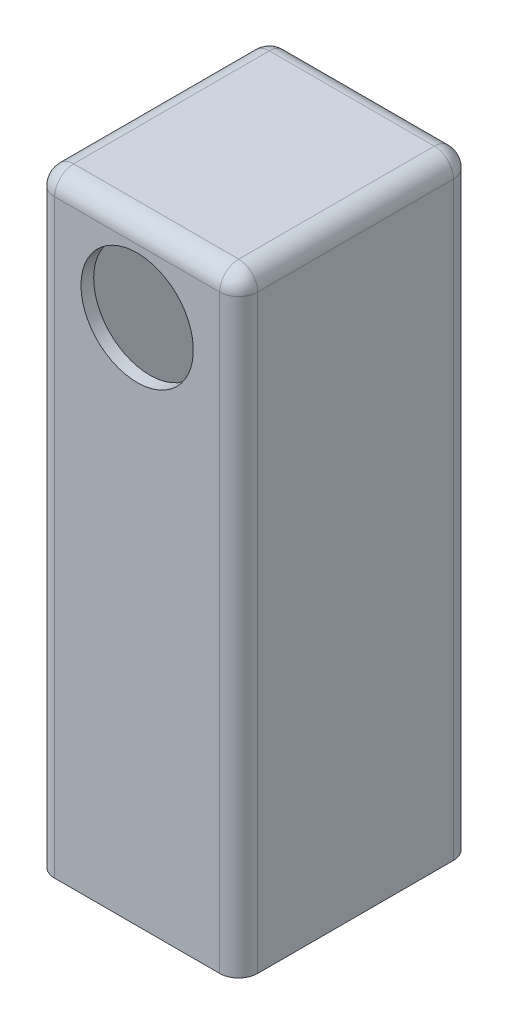
ISO-10303-21;
HEADER;
FILE_DESCRIPTION(('STEP AP214'),'2;1');
FILE_NAME('part.step','',(''),(''),'','','');
FILE_SCHEMA(('AUTOMOTIVE_DESIGN { 1 0 10303 214 1 1 1 1 }'));
ENDSEC;
DATA;
#1=APPLICATION_CONTEXT('core data for automotive mechanical design processes');
#2=APPLICATION_PROTOCOL_DEFINITION('international standard','automotive_design',2000,#1);
#3=PRODUCT_CONTEXT('',#1,'mechanical');
#4=PRODUCT('Part','Part','',(#3));
#5=PRODUCT_RELATED_PRODUCT_CATEGORY('part','',(#4));
#6=PRODUCT_DEFINITION_FORMATION('','',#4);
#7=PRODUCT_DEFINITION_CONTEXT('part definition',#1,'design');
#8=PRODUCT_DEFINITION('design','',#6,#7);
#9=PRODUCT_DEFINITION_SHAPE('','',#8);
#10=(LENGTH_UNIT() NAMED_UNIT(*) SI_UNIT(.MILLI.,.METRE.));
#11=(NAMED_UNIT(*) PLANE_ANGLE_UNIT() SI_UNIT($,.RADIAN.));
#12=(NAMED_UNIT(*) SI_UNIT($,.STERADIAN.) SOLID_ANGLE_UNIT());
#13=UNCERTAINTY_MEASURE_WITH_UNIT(LENGTH_MEASURE(1.E-05),#10,'distance_accuracy_value','');
#14=(GEOMETRIC_REPRESENTATION_CONTEXT(3) GLOBAL_UNCERTAINTY_ASSIGNED_CONTEXT((#13)) GLOBAL_UNIT_ASSIGNED_CONTEXT((#10,
#11,#12)) REPRESENTATION_CONTEXT('',''));
#15=CARTESIAN_POINT('',(0.,0.,0.));
#16=DIRECTION('',(0.,0.,1.));
#17=DIRECTION('',(1.,0.,0.));
#18=AXIS2_PLACEMENT_3D('',#15,#16,#17);
#19=CARTESIAN_POINT('',(0.,-469.9,0.));
#20=DIRECTION('',(0.,-1.,0.));
#21=DIRECTION('',(0.,0.,-1.));
#22=AXIS2_PLACEMENT_3D('',#19,#20,#21);
#23=PLANE('',#22);
#24=DIRECTION('',(-1.,0.,0.));
#25=VECTOR('',#24,1.);
#26=CARTESIAN_POINT('',(70.,-469.9,-104.09261523889));
#27=LINE('',#26,#25);
#28=CARTESIAN_POINT('',(65.,-469.9,-104.09261523889));
#29=VERTEX_POINT('',#28);
#30=CARTESIAN_POINT('',(-65.,-469.9,-104.09261523889));
#31=VERTEX_POINT('',#30);
#32=EDGE_CURVE('E183',#29,#31,#27,.T.);
#33=ORIENTED_EDGE('',*,*,#32,.F.);
#34=CARTESIAN_POINT('',(65.,-469.9,-89.0926152388896));
#35=DIRECTION('',(0.,-1.,0.));
#36=DIRECTION('',(0.,0.,-1.));
#37=AXIS2_PLACEMENT_3D('',#34,#35,#36);
#38=CIRCLE('',#37,15.);
#39=CARTESIAN_POINT('',(80.,-469.9,-89.0926152388896));
#40=VERTEX_POINT('',#39);
#41=EDGE_CURVE('E11',#29,#40,#38,.T.);
#42=ORIENTED_EDGE('',*,*,#41,.T.);
#43=DIRECTION('',(0.,0.,-1.));
#44=VECTOR('',#43,1.);
#45=CARTESIAN_POINT('',(80.,-469.9,-94.0926152388896));
#46=LINE('',#45,#44);
#47=CARTESIAN_POINT('',(80.,-469.9,65.));
#48=VERTEX_POINT('',#47);
#49=EDGE_CURVE('E178',#48,#40,#46,.T.);
#50=ORIENTED_EDGE('',*,*,#49,.F.);
#51=CARTESIAN_POINT('',(65.,-469.9,65.));
#52=DIRECTION('',(0.,-1.,0.));
#53=DIRECTION('',(0.,0.,-1.));
#54=AXIS2_PLACEMENT_3D('',#51,#52,#53);
#55=CIRCLE('',#54,15.);
#56=CARTESIAN_POINT('',(65.,-469.9,80.));
#57=VERTEX_POINT('',#56);
#58=EDGE_CURVE('E224',#48,#57,#55,.T.);
#59=ORIENTED_EDGE('',*,*,#58,.T.);
#60=DIRECTION('',(1.,0.,0.));
#61=VECTOR('',#60,1.);
#62=CARTESIAN_POINT('',(70.,-469.9,80.));
#63=LINE('',#62,#61);
#64=CARTESIAN_POINT('',(-65.,-469.9,80.));
#65=VERTEX_POINT('',#64);
#66=EDGE_CURVE('E184',#65,#57,#63,.T.);
#67=ORIENTED_EDGE('',*,*,#66,.F.);
#68=CARTESIAN_POINT('',(-65.,-469.9,65.));
#69=DIRECTION('',(0.,-1.,0.));
#70=DIRECTION('',(0.,0.,-1.));
#71=AXIS2_PLACEMENT_3D('',#68,#69,#70);
#72=CIRCLE('',#71,15.);
#73=CARTESIAN_POINT('',(-80.,-469.9,65.));
#74=VERTEX_POINT('',#73);
#75=EDGE_CURVE('E226',#65,#74,#72,.T.);
#76=ORIENTED_EDGE('',*,*,#75,.T.);
#77=DIRECTION('',(0.,0.,1.));
#78=VECTOR('',#77,1.);
#79=CARTESIAN_POINT('',(-80.,-469.9,-94.0926152388896));
#80=LINE('',#79,#78);
#81=CARTESIAN_POINT('',(-80.,-469.9,-89.0926152388896));
#82=VERTEX_POINT('',#81);
#83=EDGE_CURVE('E188',#82,#74,#80,.T.);
#84=ORIENTED_EDGE('',*,*,#83,.F.);
#85=CARTESIAN_POINT('',(-65.,-469.9,-89.0926152388896));
#86=DIRECTION('',(0.,-1.,0.));
#87=DIRECTION('',(0.,0.,-1.));
#88=AXIS2_PLACEMENT_3D('',#85,#86,#87);
#89=CIRCLE('',#88,15.);
#90=EDGE_CURVE('E44',#82,#31,#89,.T.);
#91=ORIENTED_EDGE('',*,*,#90,.T.);
#92=EDGE_LOOP('',(#33,#42,#50,#59,#67,#76,#84,#91));
#93=FACE_BOUND('',#92,.T.);
#94=DIRECTION('',(1.,0.,0.));
#95=VECTOR('',#94,1.);
#96=CARTESIAN_POINT('',(70.,-469.9,70.));
#97=LINE('',#96,#95);
#98=CARTESIAN_POINT('',(-70.,-469.9,70.));
#99=VERTEX_POINT('',#98);
#100=CARTESIAN_POINT('',(70.,-469.9,70.));
#101=VERTEX_POINT('',#100);
#102=EDGE_CURVE('E149',#99,#101,#97,.T.);
#103=ORIENTED_EDGE('',*,*,#102,.T.);
#104=DIRECTION('',(0.,0.,-1.));
#105=VECTOR('',#104,1.);
#106=CARTESIAN_POINT('',(70.,-469.9,-94.0926152388896));
#107=LINE('',#106,#105);
#108=CARTESIAN_POINT('',(70.,-469.9,-94.0926152388896));
#109=VERTEX_POINT('',#108);
#110=EDGE_CURVE('E141',#101,#109,#107,.T.);
#111=ORIENTED_EDGE('',*,*,#110,.T.);
#112=DIRECTION('',(-1.,0.,0.));
#113=VECTOR('',#112,1.);
#114=CARTESIAN_POINT('',(70.,-469.9,-94.0926152388896));
#115=LINE('',#114,#113);
#116=CARTESIAN_POINT('',(-70.,-469.9,-94.0926152388896));
#117=VERTEX_POINT('',#116);
#118=EDGE_CURVE('E153',#109,#117,#115,.T.);
#119=ORIENTED_EDGE('',*,*,#118,.T.);
#120=DIRECTION('',(0.,0.,1.));
#121=VECTOR('',#120,1.);
#122=CARTESIAN_POINT('',(-70.,-469.9,-94.0926152388896));
#123=LINE('',#122,#121);
#124=EDGE_CURVE('E157',#117,#99,#123,.T.);
#125=ORIENTED_EDGE('',*,*,#124,.T.);
#126=EDGE_LOOP('',(#103,#111,#119,#125));
#127=FACE_BOUND('',#126,.T.);
#128=ADVANCED_FACE('F35',(#93,#127),#23,.T.);
#129=CARTESIAN_POINT('',(80.,-469.9,-94.0926152388896));
#130=DIRECTION('',(1.,0.,0.));
#131=DIRECTION('',(0.,0.,-1.));
#132=AXIS2_PLACEMENT_3D('',#129,#130,#131);
#133=PLANE('',#132);
#134=ORIENTED_EDGE('',*,*,#49,.T.);
#135=DIRECTION('',(0.,1.,0.));
#136=VECTOR('',#135,1.);
#137=CARTESIAN_POINT('',(80.,-469.9,-89.0926152388896));
#138=LINE('',#137,#136);
#139=CARTESIAN_POINT('',(80.,-5.,-89.0926152388896));
#140=VERTEX_POINT('',#139);
#141=EDGE_CURVE('E52',#40,#140,#138,.T.);
#142=ORIENTED_EDGE('',*,*,#141,.T.);
#143=DIRECTION('',(0.,0.,-1.));
#144=VECTOR('',#143,1.);
#145=CARTESIAN_POINT('',(80.,-5.,80.));
#146=LINE('',#145,#144);
#147=CARTESIAN_POINT('',(80.,-5.,65.));
#148=VERTEX_POINT('',#147);
#149=EDGE_CURVE('E57',#140,#148,#146,.F.);
#150=ORIENTED_EDGE('',*,*,#149,.T.);
#151=DIRECTION('',(0.,1.,0.));
#152=VECTOR('',#151,1.);
#153=CARTESIAN_POINT('',(80.,-469.9,65.));
#154=LINE('',#153,#152);
#155=EDGE_CURVE('E220',#148,#48,#154,.F.);
#156=ORIENTED_EDGE('',*,*,#155,.T.);
#157=EDGE_LOOP('',(#134,#142,#150,#156));
#158=FACE_BOUND('',#157,.T.);
#159=ADVANCED_FACE('F295',(#158),#133,.T.);
#160=CARTESIAN_POINT('',(70.,-469.9,80.));
#161=DIRECTION('',(0.,0.,1.));
#162=DIRECTION('',(1.,0.,0.));
#163=AXIS2_PLACEMENT_3D('',#160,#161,#162);
#164=PLANE('',#163);
#165=CARTESIAN_POINT('',(0.,-55.,80.));
#166=DIRECTION('',(0.,0.,-1.));
#167=DIRECTION('',(-1.,0.,0.));
#168=AXIS2_PLACEMENT_3D('',#165,#166,#167);
#169=CIRCLE('',#168,44.25);
#170=CARTESIAN_POINT('',(-44.25,-55.,80.));
#171=VERTEX_POINT('',#170);
#172=EDGE_CURVE('E166',#171,#171,#169,.T.);
#173=ORIENTED_EDGE('',*,*,#172,.T.);
#174=EDGE_LOOP('',(#173));
#175=FACE_BOUND('',#174,.T.);
#176=DIRECTION('',(1.,0.,0.));
#177=VECTOR('',#176,1.);
#178=CARTESIAN_POINT('',(-80.,-5.,80.));
#179=LINE('',#178,#177);
#180=CARTESIAN_POINT('',(65.,-5.,80.));
#181=VERTEX_POINT('',#180);
#182=CARTESIAN_POINT('',(-65.,-5.,80.));
#183=VERTEX_POINT('',#182);
#184=EDGE_CURVE('E203',#181,#183,#179,.F.);
#185=ORIENTED_EDGE('',*,*,#184,.T.);
#186=DIRECTION('',(0.,1.,0.));
#187=VECTOR('',#186,1.);
#188=CARTESIAN_POINT('',(-65.,-469.9,80.));
#189=LINE('',#188,#187);
#190=EDGE_CURVE('E206',#183,#65,#189,.F.);
#191=ORIENTED_EDGE('',*,*,#190,.T.);
#192=ORIENTED_EDGE('',*,*,#66,.T.);
#193=DIRECTION('',(0.,1.,0.));
#194=VECTOR('',#193,1.);
#195=CARTESIAN_POINT('',(65.,-469.9,80.));
#196=LINE('',#195,#194);
#197=EDGE_CURVE('E201',#57,#181,#196,.T.);
#198=ORIENTED_EDGE('',*,*,#197,.T.);
#199=EDGE_LOOP('',(#185,#191,#192,#198));
#200=FACE_BOUND('',#199,.T.);
#201=ADVANCED_FACE('F310',(#175,#200),#164,.T.);
#202=CARTESIAN_POINT('',(-80.,-469.9,-94.0926152388896));
#203=DIRECTION('',(-1.,0.,0.));
#204=DIRECTION('',(0.,0.,1.));
#205=AXIS2_PLACEMENT_3D('',#202,#203,#204);
#206=PLANE('',#205);
#207=DIRECTION('',(0.,0.,1.));
#208=VECTOR('',#207,1.);
#209=CARTESIAN_POINT('',(-80.,-5.,-104.09261523889));
#210=LINE('',#209,#208);
#211=CARTESIAN_POINT('',(-80.,-5.,65.));
#212=VERTEX_POINT('',#211);
#213=CARTESIAN_POINT('',(-80.,-5.,-89.0926152388896));
#214=VERTEX_POINT('',#213);
#215=EDGE_CURVE('E210',#212,#214,#210,.F.);
#216=ORIENTED_EDGE('',*,*,#215,.T.);
#217=DIRECTION('',(0.,1.,0.));
#218=VECTOR('',#217,1.);
#219=CARTESIAN_POINT('',(-80.,-469.9,-89.0926152388896));
#220=LINE('',#219,#218);
#221=EDGE_CURVE('E212',#214,#82,#220,.F.);
#222=ORIENTED_EDGE('',*,*,#221,.T.);
#223=ORIENTED_EDGE('',*,*,#83,.T.);
#224=DIRECTION('',(0.,1.,0.));
#225=VECTOR('',#224,1.);
#226=CARTESIAN_POINT('',(-80.,-469.9,65.));
#227=LINE('',#226,#225);
#228=EDGE_CURVE('E208',#74,#212,#227,.T.);
#229=ORIENTED_EDGE('',*,*,#228,.T.);
#230=EDGE_LOOP('',(#216,#222,#223,#229));
#231=FACE_BOUND('',#230,.T.);
#232=ADVANCED_FACE('F319',(#231),#206,.T.);
#233=CARTESIAN_POINT('',(70.,-469.9,-104.09261523889));
#234=DIRECTION('',(0.,0.,-1.));
#235=DIRECTION('',(-1.,0.,0.));
#236=AXIS2_PLACEMENT_3D('',#233,#234,#235);
#237=PLANE('',#236);
#238=DIRECTION('',(-1.,0.,0.));
#239=VECTOR('',#238,1.);
#240=CARTESIAN_POINT('',(80.,-5.,-104.09261523889));
#241=LINE('',#240,#239);
#242=CARTESIAN_POINT('',(-65.,-5.,-104.09261523889));
#243=VERTEX_POINT('',#242);
#244=CARTESIAN_POINT('',(65.,-5.,-104.09261523889));
#245=VERTEX_POINT('',#244);
#246=EDGE_CURVE('E216',#243,#245,#241,.F.);
#247=ORIENTED_EDGE('',*,*,#246,.T.);
#248=DIRECTION('',(0.,1.,0.));
#249=VECTOR('',#248,1.);
#250=CARTESIAN_POINT('',(65.,-469.9,-104.09261523889));
#251=LINE('',#250,#249);
#252=EDGE_CURVE('E218',#245,#29,#251,.F.);
#253=ORIENTED_EDGE('',*,*,#252,.T.);
#254=ORIENTED_EDGE('',*,*,#32,.T.);
#255=DIRECTION('',(0.,1.,0.));
#256=VECTOR('',#255,1.);
#257=CARTESIAN_POINT('',(-65.,-469.9,-104.09261523889));
#258=LINE('',#257,#256);
#259=EDGE_CURVE('E214',#31,#243,#258,.T.);
#260=ORIENTED_EDGE('',*,*,#259,.T.);
#261=EDGE_LOOP('',(#247,#253,#254,#260));
#262=FACE_BOUND('',#261,.T.);
#263=ADVANCED_FACE('F286',(#262),#237,.T.);
#264=CARTESIAN_POINT('',(0.,10.,0.));
#265=DIRECTION('',(0.,-1.,0.));
#266=DIRECTION('',(0.,0.,-1.));
#267=AXIS2_PLACEMENT_3D('',#264,#265,#266);
#268=PLANE('',#267);
#269=DIRECTION('',(0.,0.,1.));
#270=VECTOR('',#269,1.);
#271=CARTESIAN_POINT('',(-65.,10.,80.));
#272=LINE('',#271,#270);
#273=CARTESIAN_POINT('',(-65.,10.,-89.0926152388896));
#274=VERTEX_POINT('',#273);
#275=CARTESIAN_POINT('',(-65.,10.,65.));
#276=VERTEX_POINT('',#275);
#277=EDGE_CURVE('E196',#274,#276,#272,.T.);
#278=ORIENTED_EDGE('',*,*,#277,.T.);
#279=DIRECTION('',(1.,0.,0.));
#280=VECTOR('',#279,1.);
#281=CARTESIAN_POINT('',(80.,10.,65.));
#282=LINE('',#281,#280);
#283=CARTESIAN_POINT('',(65.,10.,65.));
#284=VERTEX_POINT('',#283);
#285=EDGE_CURVE('E198',#276,#284,#282,.T.);
#286=ORIENTED_EDGE('',*,*,#285,.T.);
#287=DIRECTION('',(0.,0.,-1.));
#288=VECTOR('',#287,1.);
#289=CARTESIAN_POINT('',(65.,10.,-104.09261523889));
#290=LINE('',#289,#288);
#291=CARTESIAN_POINT('',(65.,10.,-89.0926152388896));
#292=VERTEX_POINT('',#291);
#293=EDGE_CURVE('E187',#284,#292,#290,.T.);
#294=ORIENTED_EDGE('',*,*,#293,.T.);
#295=DIRECTION('',(-1.,0.,0.));
#296=VECTOR('',#295,1.);
#297=CARTESIAN_POINT('',(-80.,10.,-89.0926152388896));
#298=LINE('',#297,#296);
#299=EDGE_CURVE('E194',#292,#274,#298,.T.);
#300=ORIENTED_EDGE('',*,*,#299,.T.);
#301=EDGE_LOOP('',(#278,#286,#294,#300));
#302=FACE_BOUND('',#301,.T.);
#303=ADVANCED_FACE('F276',(#302),#268,.F.);
#304=CARTESIAN_POINT('',(70.,-469.9,-94.0926152388896));
#305=DIRECTION('',(1.,0.,0.));
#306=DIRECTION('',(0.,0.,-1.));
#307=AXIS2_PLACEMENT_3D('',#304,#305,#306);
#308=PLANE('',#307);
#309=DIRECTION('',(0.,0.,-1.));
#310=VECTOR('',#309,1.);
#311=CARTESIAN_POINT('',(70.,0.,-94.0926152388896));
#312=LINE('',#311,#310);
#313=CARTESIAN_POINT('',(70.,0.,70.));
#314=VERTEX_POINT('',#313);
#315=CARTESIAN_POINT('',(70.,0.,-94.0926152388896));
#316=VERTEX_POINT('',#315);
#317=EDGE_CURVE('E144',#314,#316,#312,.T.);
#318=ORIENTED_EDGE('',*,*,#317,.T.);
#319=DIRECTION('',(0.,1.,0.));
#320=VECTOR('',#319,1.);
#321=CARTESIAN_POINT('',(70.,-469.9,-94.0926152388896));
#322=LINE('',#321,#320);
#323=EDGE_CURVE('E137',#109,#316,#322,.T.);
#324=ORIENTED_EDGE('',*,*,#323,.F.);
#325=ORIENTED_EDGE('',*,*,#110,.F.);
#326=DIRECTION('',(0.,1.,0.));
#327=VECTOR('',#326,1.);
#328=CARTESIAN_POINT('',(70.,-469.9,70.));
#329=LINE('',#328,#327);
#330=EDGE_CURVE('E176',#101,#314,#329,.T.);
#331=ORIENTED_EDGE('',*,*,#330,.T.);
#332=EDGE_LOOP('',(#318,#324,#325,#331));
#333=FACE_BOUND('',#332,.T.);
#334=ADVANCED_FACE('F139',(#333),#308,.F.);
#335=CARTESIAN_POINT('',(70.,-469.9,70.));
#336=DIRECTION('',(0.,0.,1.));
#337=DIRECTION('',(1.,0.,0.));
#338=AXIS2_PLACEMENT_3D('',#335,#336,#337);
#339=PLANE('',#338);
#340=CARTESIAN_POINT('',(0.,-55.,70.));
#341=DIRECTION('',(0.,0.,-1.));
#342=DIRECTION('',(-1.,0.,0.));
#343=AXIS2_PLACEMENT_3D('',#340,#341,#342);
#344=CIRCLE('',#343,44.25);
#345=CARTESIAN_POINT('',(-44.25,-55.,70.));
#346=VERTEX_POINT('',#345);
#347=EDGE_CURVE('E232',#346,#346,#344,.T.);
#348=ORIENTED_EDGE('',*,*,#347,.F.);
#349=EDGE_LOOP('',(#348));
#350=FACE_BOUND('',#349,.T.);
#351=DIRECTION('',(1.,0.,0.));
#352=VECTOR('',#351,1.);
#353=CARTESIAN_POINT('',(70.,0.,70.));
#354=LINE('',#353,#352);
#355=CARTESIAN_POINT('',(-70.,0.,70.));
#356=VERTEX_POINT('',#355);
#357=EDGE_CURVE('E160',#356,#314,#354,.T.);
#358=ORIENTED_EDGE('',*,*,#357,.T.);
#359=ORIENTED_EDGE('',*,*,#330,.F.);
#360=ORIENTED_EDGE('',*,*,#102,.F.);
#361=DIRECTION('',(0.,1.,0.));
#362=VECTOR('',#361,1.);
#363=CARTESIAN_POINT('',(-70.,-469.9,70.));
#364=LINE('',#363,#362);
#365=EDGE_CURVE('E179',#99,#356,#364,.T.);
#366=ORIENTED_EDGE('',*,*,#365,.T.);
#367=EDGE_LOOP('',(#358,#359,#360,#366));
#368=FACE_BOUND('',#367,.T.);
#369=ADVANCED_FACE('F424',(#350,#368),#339,.F.);
#370=CARTESIAN_POINT('',(-70.,-469.9,-94.0926152388896));
#371=DIRECTION('',(-1.,0.,0.));
#372=DIRECTION('',(0.,0.,1.));
#373=AXIS2_PLACEMENT_3D('',#370,#371,#372);
#374=PLANE('',#373);
#375=DIRECTION('',(0.,0.,1.));
#376=VECTOR('',#375,1.);
#377=CARTESIAN_POINT('',(-70.,0.,-94.0926152388896));
#378=LINE('',#377,#376);
#379=CARTESIAN_POINT('',(-70.,0.,-94.0926152388896));
#380=VERTEX_POINT('',#379);
#381=EDGE_CURVE('E163',#380,#356,#378,.T.);
#382=ORIENTED_EDGE('',*,*,#381,.T.);
#383=ORIENTED_EDGE('',*,*,#365,.F.);
#384=ORIENTED_EDGE('',*,*,#124,.F.);
#385=DIRECTION('',(0.,1.,0.));
#386=VECTOR('',#385,1.);
#387=CARTESIAN_POINT('',(-70.,-469.9,-94.0926152388896));
#388=LINE('',#387,#386);
#389=EDGE_CURVE('E148',#117,#380,#388,.T.);
#390=ORIENTED_EDGE('',*,*,#389,.T.);
#391=EDGE_LOOP('',(#382,#383,#384,#390));
#392=FACE_BOUND('',#391,.T.);
#393=ADVANCED_FACE('F428',(#392),#374,.F.);
#394=CARTESIAN_POINT('',(70.,-469.9,-94.0926152388896));
#395=DIRECTION('',(0.,0.,-1.));
#396=DIRECTION('',(-1.,0.,0.));
#397=AXIS2_PLACEMENT_3D('',#394,#395,#396);
#398=PLANE('',#397);
#399=DIRECTION('',(-1.,0.,0.));
#400=VECTOR('',#399,1.);
#401=CARTESIAN_POINT('',(70.,0.,-94.0926152388896));
#402=LINE('',#401,#400);
#403=EDGE_CURVE('E172',#316,#380,#402,.T.);
#404=ORIENTED_EDGE('',*,*,#403,.T.);
#405=ORIENTED_EDGE('',*,*,#389,.F.);
#406=ORIENTED_EDGE('',*,*,#118,.F.);
#407=ORIENTED_EDGE('',*,*,#323,.T.);
#408=EDGE_LOOP('',(#404,#405,#406,#407));
#409=FACE_BOUND('',#408,.T.);
#410=ADVANCED_FACE('F154',(#409),#398,.F.);
#411=CARTESIAN_POINT('',(0.,0.,0.));
#412=DIRECTION('',(0.,-1.,0.));
#413=DIRECTION('',(0.,0.,-1.));
#414=AXIS2_PLACEMENT_3D('',#411,#412,#413);
#415=PLANE('',#414);
#416=ORIENTED_EDGE('',*,*,#317,.F.);
#417=ORIENTED_EDGE('',*,*,#357,.F.);
#418=ORIENTED_EDGE('',*,*,#381,.F.);
#419=ORIENTED_EDGE('',*,*,#403,.F.);
#420=EDGE_LOOP('',(#416,#417,#418,#419));
#421=FACE_BOUND('',#420,.T.);
#422=ADVANCED_FACE('F322',(#421),#415,.T.);
#423=CARTESIAN_POINT('',(-65.,-469.9,-89.0926152388896));
#424=DIRECTION('',(0.,1.,0.));
#425=DIRECTION('',(0.,0.,1.));
#426=AXIS2_PLACEMENT_3D('',#423,#424,#425);
#427=CYLINDRICAL_SURFACE('',#426,15.);
#428=ORIENTED_EDGE('',*,*,#90,.F.);
#429=ORIENTED_EDGE('',*,*,#221,.F.);
#430=CARTESIAN_POINT('',(-65.,-5.,-89.0926152388896));
#431=DIRECTION('',(0.,1.,0.));
#432=DIRECTION('',(0.,0.,1.));
#433=AXIS2_PLACEMENT_3D('',#430,#431,#432);
#434=CIRCLE('',#433,15.);
#435=EDGE_CURVE('E39',#243,#214,#434,.T.);
#436=ORIENTED_EDGE('',*,*,#435,.F.);
#437=ORIENTED_EDGE('',*,*,#259,.F.);
#438=EDGE_LOOP('',(#428,#429,#436,#437));
#439=FACE_BOUND('',#438,.T.);
#440=ADVANCED_FACE('F37',(#439),#427,.T.);
#441=CARTESIAN_POINT('',(0.,-5.,-89.0926152388896));
#442=DIRECTION('',(1.,0.,0.));
#443=DIRECTION('',(0.,0.,-1.));
#444=AXIS2_PLACEMENT_3D('',#441,#442,#443);
#445=CYLINDRICAL_SURFACE('',#444,15.);
#446=CARTESIAN_POINT('',(65.,-5.,-89.0926152388896));
#447=DIRECTION('',(1.,0.,0.));
#448=DIRECTION('',(0.,0.,-1.));
#449=AXIS2_PLACEMENT_3D('',#446,#447,#448);
#450=CIRCLE('',#449,15.);
#451=EDGE_CURVE('E255',#245,#292,#450,.T.);
#452=ORIENTED_EDGE('',*,*,#451,.F.);
#453=ORIENTED_EDGE('',*,*,#246,.F.);
#454=CARTESIAN_POINT('',(-65.,-5.,-89.0926152388896));
#455=DIRECTION('',(-1.,0.,0.));
#456=DIRECTION('',(0.,0.,1.));
#457=AXIS2_PLACEMENT_3D('',#454,#455,#456);
#458=CIRCLE('',#457,15.);
#459=EDGE_CURVE('E257',#274,#243,#458,.T.);
#460=ORIENTED_EDGE('',*,*,#459,.F.);
#461=ORIENTED_EDGE('',*,*,#299,.F.);
#462=EDGE_LOOP('',(#452,#453,#460,#461));
#463=FACE_BOUND('',#462,.T.);
#464=ADVANCED_FACE('F283',(#463),#445,.T.);
#465=CARTESIAN_POINT('',(65.,-469.9,-89.0926152388896));
#466=DIRECTION('',(0.,1.,0.));
#467=DIRECTION('',(0.,0.,1.));
#468=AXIS2_PLACEMENT_3D('',#465,#466,#467);
#469=CYLINDRICAL_SURFACE('',#468,15.);
#470=ORIENTED_EDGE('',*,*,#41,.F.);
#471=ORIENTED_EDGE('',*,*,#252,.F.);
#472=CARTESIAN_POINT('',(65.,-5.,-89.0926152388896));
#473=DIRECTION('',(0.,1.,0.));
#474=DIRECTION('',(0.,0.,1.));
#475=AXIS2_PLACEMENT_3D('',#472,#473,#474);
#476=CIRCLE('',#475,15.);
#477=EDGE_CURVE('E252',#140,#245,#476,.T.);
#478=ORIENTED_EDGE('',*,*,#477,.F.);
#479=ORIENTED_EDGE('',*,*,#141,.F.);
#480=EDGE_LOOP('',(#470,#471,#478,#479));
#481=FACE_BOUND('',#480,.T.);
#482=ADVANCED_FACE('F290',(#481),#469,.T.);
#483=CARTESIAN_POINT('',(-65.,-5.,-89.0926152388896));
#484=DIRECTION('',(0.,0.,1.));
#485=DIRECTION('',(1.,0.,0.));
#486=AXIS2_PLACEMENT_3D('',#483,#484,#485);
#487=SPHERICAL_SURFACE('',#486,15.);
#488=ORIENTED_EDGE('',*,*,#459,.T.);
#489=ORIENTED_EDGE('',*,*,#435,.T.);
#490=CARTESIAN_POINT('',(-65.,-5.,-89.0926152388896));
#491=DIRECTION('',(0.,0.,-1.));
#492=DIRECTION('',(-1.,0.,0.));
#493=AXIS2_PLACEMENT_3D('',#490,#491,#492);
#494=CIRCLE('',#493,15.);
#495=EDGE_CURVE('E249',#274,#214,#494,.F.);
#496=ORIENTED_EDGE('',*,*,#495,.F.);
#497=EDGE_LOOP('',(#488,#489,#496));
#498=FACE_BOUND('',#497,.T.);
#499=ADVANCED_FACE('F264',(#498),#487,.T.);
#500=CARTESIAN_POINT('',(65.,-5.,-89.0926152388896));
#501=DIRECTION('',(0.,0.,1.));
#502=DIRECTION('',(1.,0.,0.));
#503=AXIS2_PLACEMENT_3D('',#500,#501,#502);
#504=SPHERICAL_SURFACE('',#503,15.);
#505=ORIENTED_EDGE('',*,*,#477,.T.);
#506=ORIENTED_EDGE('',*,*,#451,.T.);
#507=CARTESIAN_POINT('',(65.,-5.,-89.0926152388896));
#508=DIRECTION('',(0.,0.,-1.));
#509=DIRECTION('',(-1.,0.,0.));
#510=AXIS2_PLACEMENT_3D('',#507,#508,#509);
#511=CIRCLE('',#510,15.);
#512=EDGE_CURVE('E246',#140,#292,#511,.F.);
#513=ORIENTED_EDGE('',*,*,#512,.F.);
#514=EDGE_LOOP('',(#505,#506,#513));
#515=FACE_BOUND('',#514,.T.);
#516=ADVANCED_FACE('F364',(#515),#504,.T.);
#517=CARTESIAN_POINT('',(-65.,-469.9,65.));
#518=DIRECTION('',(0.,1.,0.));
#519=DIRECTION('',(0.,0.,1.));
#520=AXIS2_PLACEMENT_3D('',#517,#518,#519);
#521=CYLINDRICAL_SURFACE('',#520,15.);
#522=ORIENTED_EDGE('',*,*,#75,.F.);
#523=ORIENTED_EDGE('',*,*,#190,.F.);
#524=CARTESIAN_POINT('',(-65.,-5.,65.));
#525=DIRECTION('',(0.,1.,0.));
#526=DIRECTION('',(0.,0.,1.));
#527=AXIS2_PLACEMENT_3D('',#524,#525,#526);
#528=CIRCLE('',#527,15.);
#529=EDGE_CURVE('E243',#212,#183,#528,.T.);
#530=ORIENTED_EDGE('',*,*,#529,.F.);
#531=ORIENTED_EDGE('',*,*,#228,.F.);
#532=EDGE_LOOP('',(#522,#523,#530,#531));
#533=FACE_BOUND('',#532,.T.);
#534=ADVANCED_FACE('F317',(#533),#521,.T.);
#535=CARTESIAN_POINT('',(-65.,-5.,0.));
#536=DIRECTION('',(0.,0.,-1.));
#537=DIRECTION('',(-1.,0.,0.));
#538=AXIS2_PLACEMENT_3D('',#535,#536,#537);
#539=CYLINDRICAL_SURFACE('',#538,15.);
#540=ORIENTED_EDGE('',*,*,#495,.T.);
#541=ORIENTED_EDGE('',*,*,#215,.F.);
#542=CARTESIAN_POINT('',(-65.,-5.,65.));
#543=DIRECTION('',(0.,0.,1.));
#544=DIRECTION('',(1.,0.,0.));
#545=AXIS2_PLACEMENT_3D('',#542,#543,#544);
#546=CIRCLE('',#545,15.);
#547=EDGE_CURVE('E240',#276,#212,#546,.T.);
#548=ORIENTED_EDGE('',*,*,#547,.F.);
#549=ORIENTED_EDGE('',*,*,#277,.F.);
#550=EDGE_LOOP('',(#540,#541,#548,#549));
#551=FACE_BOUND('',#550,.T.);
#552=ADVANCED_FACE('F271',(#551),#539,.T.);
#553=CARTESIAN_POINT('',(65.,-5.,0.));
#554=DIRECTION('',(0.,0.,1.));
#555=DIRECTION('',(1.,0.,0.));
#556=AXIS2_PLACEMENT_3D('',#553,#554,#555);
#557=CYLINDRICAL_SURFACE('',#556,15.);
#558=ORIENTED_EDGE('',*,*,#512,.T.);
#559=ORIENTED_EDGE('',*,*,#293,.F.);
#560=CARTESIAN_POINT('',(65.,-5.,65.));
#561=DIRECTION('',(0.,0.,1.));
#562=DIRECTION('',(1.,0.,0.));
#563=AXIS2_PLACEMENT_3D('',#560,#561,#562);
#564=CIRCLE('',#563,15.);
#565=EDGE_CURVE('E237',#148,#284,#564,.T.);
#566=ORIENTED_EDGE('',*,*,#565,.F.);
#567=ORIENTED_EDGE('',*,*,#149,.F.);
#568=EDGE_LOOP('',(#558,#559,#566,#567));
#569=FACE_BOUND('',#568,.T.);
#570=ADVANCED_FACE('F303',(#569),#557,.T.);
#571=CARTESIAN_POINT('',(65.,-469.9,65.));
#572=DIRECTION('',(0.,1.,0.));
#573=DIRECTION('',(0.,0.,1.));
#574=AXIS2_PLACEMENT_3D('',#571,#572,#573);
#575=CYLINDRICAL_SURFACE('',#574,15.);
#576=ORIENTED_EDGE('',*,*,#58,.F.);
#577=ORIENTED_EDGE('',*,*,#155,.F.);
#578=CARTESIAN_POINT('',(65.,-5.,65.));
#579=DIRECTION('',(0.,1.,0.));
#580=DIRECTION('',(0.,0.,1.));
#581=AXIS2_PLACEMENT_3D('',#578,#579,#580);
#582=CIRCLE('',#581,15.);
#583=EDGE_CURVE('E234',#181,#148,#582,.T.);
#584=ORIENTED_EDGE('',*,*,#583,.F.);
#585=ORIENTED_EDGE('',*,*,#197,.F.);
#586=EDGE_LOOP('',(#576,#577,#584,#585));
#587=FACE_BOUND('',#586,.T.);
#588=ADVANCED_FACE('F299',(#587),#575,.T.);
#589=CARTESIAN_POINT('',(-65.,-5.,65.));
#590=DIRECTION('',(0.,0.,1.));
#591=DIRECTION('',(1.,0.,0.));
#592=AXIS2_PLACEMENT_3D('',#589,#590,#591);
#593=SPHERICAL_SURFACE('',#592,15.);
#594=ORIENTED_EDGE('',*,*,#547,.T.);
#595=ORIENTED_EDGE('',*,*,#529,.T.);
#596=CARTESIAN_POINT('',(-65.,-5.,65.));
#597=DIRECTION('',(-1.,0.,0.));
#598=DIRECTION('',(0.,0.,1.));
#599=AXIS2_PLACEMENT_3D('',#596,#597,#598);
#600=CIRCLE('',#599,15.);
#601=EDGE_CURVE('E231',#276,#183,#600,.F.);
#602=ORIENTED_EDGE('',*,*,#601,.F.);
#603=EDGE_LOOP('',(#594,#595,#602));
#604=FACE_BOUND('',#603,.T.);
#605=ADVANCED_FACE('F352',(#604),#593,.T.);
#606=CARTESIAN_POINT('',(65.,-5.,65.));
#607=DIRECTION('',(0.,0.,1.));
#608=DIRECTION('',(1.,0.,0.));
#609=AXIS2_PLACEMENT_3D('',#606,#607,#608);
#610=SPHERICAL_SURFACE('',#609,15.);
#611=ORIENTED_EDGE('',*,*,#583,.T.);
#612=ORIENTED_EDGE('',*,*,#565,.T.);
#613=CARTESIAN_POINT('',(65.,-5.,65.));
#614=DIRECTION('',(1.,0.,0.));
#615=DIRECTION('',(0.,0.,-1.));
#616=AXIS2_PLACEMENT_3D('',#613,#614,#615);
#617=CIRCLE('',#616,15.);
#618=EDGE_CURVE('E229',#181,#284,#617,.F.);
#619=ORIENTED_EDGE('',*,*,#618,.F.);
#620=EDGE_LOOP('',(#611,#612,#619));
#621=FACE_BOUND('',#620,.T.);
#622=ADVANCED_FACE('F306',(#621),#610,.T.);
#623=CARTESIAN_POINT('',(0.,-5.,65.));
#624=DIRECTION('',(-1.,0.,0.));
#625=DIRECTION('',(0.,0.,1.));
#626=AXIS2_PLACEMENT_3D('',#623,#624,#625);
#627=CYLINDRICAL_SURFACE('',#626,15.);
#628=ORIENTED_EDGE('',*,*,#601,.T.);
#629=ORIENTED_EDGE('',*,*,#184,.F.);
#630=ORIENTED_EDGE('',*,*,#618,.T.);
#631=ORIENTED_EDGE('',*,*,#285,.F.);
#632=EDGE_LOOP('',(#628,#629,#630,#631));
#633=FACE_BOUND('',#632,.T.);
#634=ADVANCED_FACE('F308',(#633),#627,.T.);
#635=CARTESIAN_POINT('',(0.,-55.,70.));
#636=DIRECTION('',(0.,0.,1.));
#637=DIRECTION('',(1.,0.,0.));
#638=AXIS2_PLACEMENT_3D('',#635,#636,#637);
#639=CYLINDRICAL_SURFACE('',#638,44.25);
#640=ORIENTED_EDGE('',*,*,#347,.T.);
#641=EDGE_LOOP('',(#640));
#642=FACE_BOUND('',#641,.T.);
#643=ORIENTED_EDGE('',*,*,#172,.F.);
#644=EDGE_LOOP('',(#643));
#645=FACE_BOUND('',#644,.T.);
#646=ADVANCED_FACE('F349',(#642,#645),#639,.F.);
#647=CLOSED_SHELL('',(#128,#159,#201,#232,#263,#303,#334,#369,#393,#410,#422,#440,#464,#482,
#499,#516,#534,#552,#570,#588,#605,#622,#634,#646));
#648=MANIFOLD_SOLID_BREP('B2',#647);
#649=ADVANCED_BREP_SHAPE_REPRESENTATION('',(#18,#648),#14);
#650=SHAPE_DEFINITION_REPRESENTATION(#9,#649);
ENDSEC;
END-ISO-10303-21;
